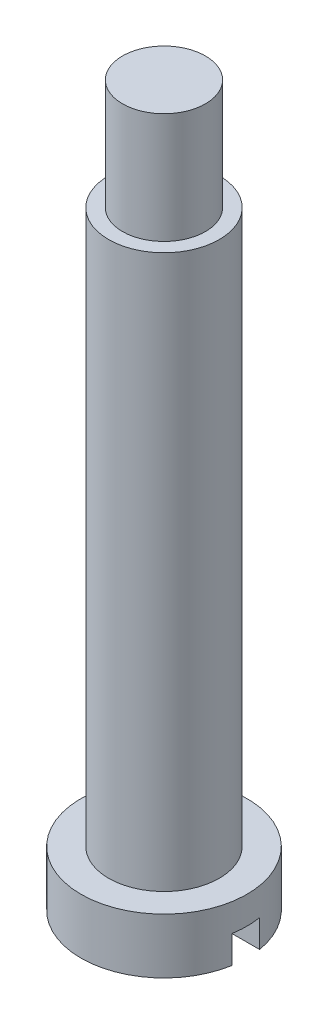
ISO-10303-21;
HEADER;
FILE_DESCRIPTION(('STEP AP214'),'2;1');
FILE_NAME('part.step','',(''),(''),'','','');
FILE_SCHEMA(('AUTOMOTIVE_DESIGN { 1 0 10303 214 1 1 1 1 }'));
ENDSEC;
DATA;
#1=APPLICATION_CONTEXT('core data for automotive mechanical design processes');
#2=APPLICATION_PROTOCOL_DEFINITION('international standard','automotive_design',2000,#1);
#3=PRODUCT_CONTEXT('',#1,'mechanical');
#4=PRODUCT('Part','Part','',(#3));
#5=PRODUCT_RELATED_PRODUCT_CATEGORY('part','',(#4));
#6=PRODUCT_DEFINITION_FORMATION('','',#4);
#7=PRODUCT_DEFINITION_CONTEXT('part definition',#1,'design');
#8=PRODUCT_DEFINITION('design','',#6,#7);
#9=PRODUCT_DEFINITION_SHAPE('','',#8);
#10=(LENGTH_UNIT() NAMED_UNIT(*) SI_UNIT(.MILLI.,.METRE.));
#11=(NAMED_UNIT(*) PLANE_ANGLE_UNIT() SI_UNIT($,.RADIAN.));
#12=(NAMED_UNIT(*) SI_UNIT($,.STERADIAN.) SOLID_ANGLE_UNIT());
#13=UNCERTAINTY_MEASURE_WITH_UNIT(LENGTH_MEASURE(1.E-05),#10,'distance_accuracy_value','');
#14=(GEOMETRIC_REPRESENTATION_CONTEXT(3) GLOBAL_UNCERTAINTY_ASSIGNED_CONTEXT((#13)) GLOBAL_UNIT_ASSIGNED_CONTEXT((#10,
#11,#12)) REPRESENTATION_CONTEXT('',''));
#15=CARTESIAN_POINT('',(0.,0.,0.));
#16=DIRECTION('',(0.,0.,1.));
#17=DIRECTION('',(1.,0.,0.));
#18=AXIS2_PLACEMENT_3D('',#15,#16,#17);
#19=CARTESIAN_POINT('',(0.,-2.,0.));
#20=DIRECTION('',(0.,1.,0.));
#21=DIRECTION('',(0.,0.,1.));
#22=AXIS2_PLACEMENT_3D('',#19,#20,#21);
#23=CYLINDRICAL_SURFACE('',#22,3.);
#24=CARTESIAN_POINT('',(0.,0.,0.));
#25=DIRECTION('',(0.,1.,0.));
#26=DIRECTION('',(0.,0.,1.));
#27=AXIS2_PLACEMENT_3D('',#24,#25,#26);
#28=CIRCLE('',#27,3.);
#29=CARTESIAN_POINT('',(0.,0.,3.));
#30=VERTEX_POINT('',#29);
#31=EDGE_CURVE('E127',#30,#30,#28,.T.);
#32=ORIENTED_EDGE('',*,*,#31,.F.);
#33=EDGE_LOOP('',(#32));
#34=FACE_BOUND('',#33,.T.);
#35=CARTESIAN_POINT('',(0.,-2.,0.));
#36=DIRECTION('',(0.,1.,0.));
#37=DIRECTION('',(0.,0.,1.));
#38=AXIS2_PLACEMENT_3D('',#35,#36,#37);
#39=CIRCLE('',#38,3.);
#40=CARTESIAN_POINT('',(2.95803989154981,-2.,-0.5));
#41=VERTEX_POINT('',#40);
#42=CARTESIAN_POINT('',(-2.95803989154981,-2.,-0.5));
#43=VERTEX_POINT('',#42);
#44=EDGE_CURVE('E131',#41,#43,#39,.T.);
#45=ORIENTED_EDGE('',*,*,#44,.T.);
#46=DIRECTION('',(0.,1.,0.));
#47=VECTOR('',#46,1.);
#48=CARTESIAN_POINT('',(-2.95803989154981,-2.,-0.5));
#49=LINE('',#48,#47);
#50=CARTESIAN_POINT('',(-2.95803989154981,-1.,-0.5));
#51=VERTEX_POINT('',#50);
#52=EDGE_CURVE('E90',#43,#51,#49,.T.);
#53=ORIENTED_EDGE('',*,*,#52,.T.);
#54=CARTESIAN_POINT('',(0.,-1.,0.));
#55=DIRECTION('',(0.,1.,0.));
#56=DIRECTION('',(0.,0.,1.));
#57=AXIS2_PLACEMENT_3D('',#54,#55,#56);
#58=CIRCLE('',#57,3.);
#59=CARTESIAN_POINT('',(-2.95803989154981,-1.,0.5));
#60=VERTEX_POINT('',#59);
#61=EDGE_CURVE('E11',#60,#51,#58,.F.);
#62=ORIENTED_EDGE('',*,*,#61,.F.);
#63=DIRECTION('',(0.,1.,0.));
#64=VECTOR('',#63,1.);
#65=CARTESIAN_POINT('',(-2.95803989154981,-2.,0.5));
#66=LINE('',#65,#64);
#67=CARTESIAN_POINT('',(-2.95803989154981,-2.,0.5));
#68=VERTEX_POINT('',#67);
#69=EDGE_CURVE('E88',#68,#60,#66,.T.);
#70=ORIENTED_EDGE('',*,*,#69,.F.);
#71=CARTESIAN_POINT('',(2.95803989154981,-2.,0.5));
#72=VERTEX_POINT('',#71);
#73=EDGE_CURVE('E132',#68,#72,#39,.T.);
#74=ORIENTED_EDGE('',*,*,#73,.T.);
#75=DIRECTION('',(0.,1.,0.));
#76=VECTOR('',#75,1.);
#77=CARTESIAN_POINT('',(2.95803989154981,-2.,0.5));
#78=LINE('',#77,#76);
#79=CARTESIAN_POINT('',(2.95803989154981,-1.,0.5));
#80=VERTEX_POINT('',#79);
#81=EDGE_CURVE('E58',#80,#72,#78,.F.);
#82=ORIENTED_EDGE('',*,*,#81,.F.);
#83=CARTESIAN_POINT('',(2.95803989154981,-1.,-0.5));
#84=VERTEX_POINT('',#83);
#85=EDGE_CURVE('E46',#84,#80,#58,.F.);
#86=ORIENTED_EDGE('',*,*,#85,.F.);
#87=DIRECTION('',(0.,1.,0.));
#88=VECTOR('',#87,1.);
#89=CARTESIAN_POINT('',(2.95803989154981,-2.,-0.5));
#90=LINE('',#89,#88);
#91=EDGE_CURVE('E111',#84,#41,#90,.F.);
#92=ORIENTED_EDGE('',*,*,#91,.T.);
#93=EDGE_LOOP('',(#45,#53,#62,#70,#74,#82,#86,#92));
#94=FACE_BOUND('',#93,.T.);
#95=ADVANCED_FACE('F43',(#34,#94),#23,.T.);
#96=CARTESIAN_POINT('',(0.,-2.,0.));
#97=DIRECTION('',(0.,1.,0.));
#98=DIRECTION('',(0.,0.,1.));
#99=AXIS2_PLACEMENT_3D('',#96,#97,#98);
#100=PLANE('',#99);
#101=DIRECTION('',(1.,0.,0.));
#102=VECTOR('',#101,1.);
#103=CARTESIAN_POINT('',(0.,-2.,-0.5));
#104=LINE('',#103,#102);
#105=EDGE_CURVE('E66',#43,#41,#104,.T.);
#106=ORIENTED_EDGE('',*,*,#105,.F.);
#107=ORIENTED_EDGE('',*,*,#44,.F.);
#108=EDGE_LOOP('',(#106,#107));
#109=FACE_BOUND('',#108,.T.);
#110=ADVANCED_FACE('F144',(#109),#100,.F.);
#111=ORIENTED_EDGE('',*,*,#73,.F.);
#112=DIRECTION('',(1.,0.,0.));
#113=VECTOR('',#112,1.);
#114=CARTESIAN_POINT('',(0.,-2.,0.5));
#115=LINE('',#114,#113);
#116=EDGE_CURVE('E97',#68,#72,#115,.T.);
#117=ORIENTED_EDGE('',*,*,#116,.T.);
#118=EDGE_LOOP('',(#111,#117));
#119=FACE_BOUND('',#118,.T.);
#120=ADVANCED_FACE('F146',(#119),#100,.F.);
#121=CARTESIAN_POINT('',(0.,0.,0.));
#122=DIRECTION('',(0.,1.,0.));
#123=DIRECTION('',(0.,0.,1.));
#124=AXIS2_PLACEMENT_3D('',#121,#122,#123);
#125=PLANE('',#124);
#126=CARTESIAN_POINT('',(0.,0.,0.));
#127=DIRECTION('',(0.,1.,0.));
#128=DIRECTION('',(0.,0.,1.));
#129=AXIS2_PLACEMENT_3D('',#126,#127,#128);
#130=CIRCLE('',#129,2.);
#131=CARTESIAN_POINT('',(0.,0.,2.));
#132=VERTEX_POINT('',#131);
#133=EDGE_CURVE('E123',#132,#132,#130,.T.);
#134=ORIENTED_EDGE('',*,*,#133,.F.);
#135=EDGE_LOOP('',(#134));
#136=FACE_BOUND('',#135,.T.);
#137=ORIENTED_EDGE('',*,*,#31,.T.);
#138=EDGE_LOOP('',(#137));
#139=FACE_BOUND('',#138,.T.);
#140=ADVANCED_FACE('F152',(#136,#139),#125,.T.);
#141=CARTESIAN_POINT('',(0.,20.,0.));
#142=DIRECTION('',(0.,-1.,0.));
#143=DIRECTION('',(0.,0.,-1.));
#144=AXIS2_PLACEMENT_3D('',#141,#142,#143);
#145=CYLINDRICAL_SURFACE('',#144,2.);
#146=CARTESIAN_POINT('',(0.,20.,0.));
#147=DIRECTION('',(0.,1.,0.));
#148=DIRECTION('',(0.,0.,1.));
#149=AXIS2_PLACEMENT_3D('',#146,#147,#148);
#150=CIRCLE('',#149,2.);
#151=CARTESIAN_POINT('',(0.,20.,2.));
#152=VERTEX_POINT('',#151);
#153=EDGE_CURVE('E118',#152,#152,#150,.T.);
#154=ORIENTED_EDGE('',*,*,#153,.F.);
#155=EDGE_LOOP('',(#154));
#156=FACE_BOUND('',#155,.T.);
#157=ORIENTED_EDGE('',*,*,#133,.T.);
#158=EDGE_LOOP('',(#157));
#159=FACE_BOUND('',#158,.T.);
#160=ADVANCED_FACE('F156',(#156,#159),#145,.T.);
#161=CARTESIAN_POINT('',(0.,20.,0.));
#162=DIRECTION('',(0.,1.,0.));
#163=DIRECTION('',(0.,0.,1.));
#164=AXIS2_PLACEMENT_3D('',#161,#162,#163);
#165=PLANE('',#164);
#166=CARTESIAN_POINT('',(0.,20.,0.));
#167=DIRECTION('',(0.,1.,0.));
#168=DIRECTION('',(0.,0.,1.));
#169=AXIS2_PLACEMENT_3D('',#166,#167,#168);
#170=CIRCLE('',#169,1.5);
#171=CARTESIAN_POINT('',(0.,20.,1.5));
#172=VERTEX_POINT('',#171);
#173=EDGE_CURVE('E119',#172,#172,#170,.T.);
#174=ORIENTED_EDGE('',*,*,#173,.F.);
#175=EDGE_LOOP('',(#174));
#176=FACE_BOUND('',#175,.T.);
#177=ORIENTED_EDGE('',*,*,#153,.T.);
#178=EDGE_LOOP('',(#177));
#179=FACE_BOUND('',#178,.T.);
#180=ADVANCED_FACE('F163',(#176,#179),#165,.T.);
#181=CARTESIAN_POINT('',(0.,24.,0.));
#182=DIRECTION('',(0.,-1.,0.));
#183=DIRECTION('',(0.,0.,-1.));
#184=AXIS2_PLACEMENT_3D('',#181,#182,#183);
#185=CYLINDRICAL_SURFACE('',#184,1.5);
#186=CARTESIAN_POINT('',(0.,24.,0.));
#187=DIRECTION('',(0.,1.,0.));
#188=DIRECTION('',(0.,0.,1.));
#189=AXIS2_PLACEMENT_3D('',#186,#187,#188);
#190=CIRCLE('',#189,1.5);
#191=CARTESIAN_POINT('',(0.,24.,1.5));
#192=VERTEX_POINT('',#191);
#193=EDGE_CURVE('E114',#192,#192,#190,.T.);
#194=ORIENTED_EDGE('',*,*,#193,.F.);
#195=EDGE_LOOP('',(#194));
#196=FACE_BOUND('',#195,.T.);
#197=ORIENTED_EDGE('',*,*,#173,.T.);
#198=EDGE_LOOP('',(#197));
#199=FACE_BOUND('',#198,.T.);
#200=ADVANCED_FACE('F172',(#196,#199),#185,.T.);
#201=CARTESIAN_POINT('',(0.,24.,0.));
#202=DIRECTION('',(0.,1.,0.));
#203=DIRECTION('',(0.,0.,1.));
#204=AXIS2_PLACEMENT_3D('',#201,#202,#203);
#205=PLANE('',#204);
#206=ORIENTED_EDGE('',*,*,#193,.T.);
#207=EDGE_LOOP('',(#206));
#208=FACE_BOUND('',#207,.T.);
#209=ADVANCED_FACE('F179',(#208),#205,.T.);
#210=CARTESIAN_POINT('',(-3.,-2.000012,-0.5));
#211=DIRECTION('',(0.,0.,1.));
#212=DIRECTION('',(1.,0.,0.));
#213=AXIS2_PLACEMENT_3D('',#210,#211,#212);
#214=PLANE('',#213);
#215=DIRECTION('',(1.,0.,0.));
#216=VECTOR('',#215,1.);
#217=CARTESIAN_POINT('',(-3.,-1.,-0.5));
#218=LINE('',#217,#216);
#219=EDGE_CURVE('E102',#51,#84,#218,.T.);
#220=ORIENTED_EDGE('',*,*,#219,.F.);
#221=ORIENTED_EDGE('',*,*,#52,.F.);
#222=ORIENTED_EDGE('',*,*,#105,.T.);
#223=ORIENTED_EDGE('',*,*,#91,.F.);
#224=EDGE_LOOP('',(#220,#221,#222,#223));
#225=FACE_BOUND('',#224,.T.);
#226=ADVANCED_FACE('F186',(#225),#214,.T.);
#227=CARTESIAN_POINT('',(-3.,-2.000012,0.5));
#228=DIRECTION('',(0.,0.,1.));
#229=DIRECTION('',(1.,0.,0.));
#230=AXIS2_PLACEMENT_3D('',#227,#228,#229);
#231=PLANE('',#230);
#232=ORIENTED_EDGE('',*,*,#81,.T.);
#233=ORIENTED_EDGE('',*,*,#116,.F.);
#234=ORIENTED_EDGE('',*,*,#69,.T.);
#235=DIRECTION('',(1.,0.,0.));
#236=VECTOR('',#235,1.);
#237=CARTESIAN_POINT('',(-3.,-1.,0.5));
#238=LINE('',#237,#236);
#239=EDGE_CURVE('E96',#60,#80,#238,.T.);
#240=ORIENTED_EDGE('',*,*,#239,.T.);
#241=EDGE_LOOP('',(#232,#233,#234,#240));
#242=FACE_BOUND('',#241,.T.);
#243=ADVANCED_FACE('F95',(#242),#231,.F.);
#244=CARTESIAN_POINT('',(0.,-1.,0.));
#245=DIRECTION('',(0.,1.,0.));
#246=DIRECTION('',(-1.,0.,0.));
#247=AXIS2_PLACEMENT_3D('',#244,#245,#246);
#248=PLANE('',#247);
#249=ORIENTED_EDGE('',*,*,#239,.F.);
#250=ORIENTED_EDGE('',*,*,#61,.T.);
#251=ORIENTED_EDGE('',*,*,#219,.T.);
#252=ORIENTED_EDGE('',*,*,#85,.T.);
#253=EDGE_LOOP('',(#249,#250,#251,#252));
#254=FACE_BOUND('',#253,.T.);
#255=ADVANCED_FACE('F100',(#254),#248,.F.);
#256=CLOSED_SHELL('',(#95,#110,#120,#140,#160,#180,#200,#209,#226,#243,#255));
#257=MANIFOLD_SOLID_BREP('B2',#256);
#258=ADVANCED_BREP_SHAPE_REPRESENTATION('',(#18,#257),#14);
#259=SHAPE_DEFINITION_REPRESENTATION(#9,#258);
ENDSEC;
END-ISO-10303-21;
